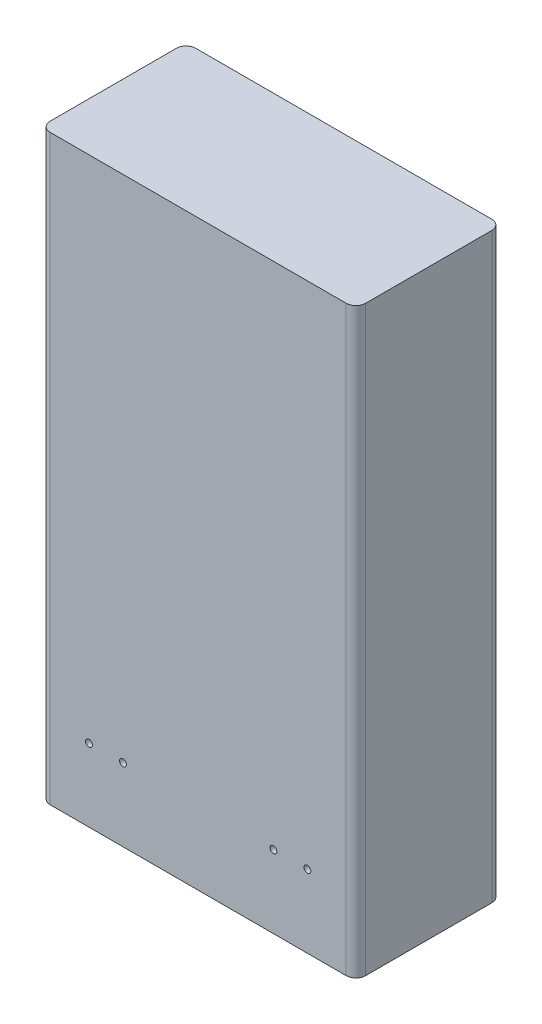
ISO-10303-21;
HEADER;
FILE_DESCRIPTION(('STEP AP214'),'2;1');
FILE_NAME('part.step','',(''),(''),'','','');
FILE_SCHEMA(('AUTOMOTIVE_DESIGN { 1 0 10303 214 1 1 1 1 }'));
ENDSEC;
DATA;
#1=APPLICATION_CONTEXT('core data for automotive mechanical design processes');
#2=APPLICATION_PROTOCOL_DEFINITION('international standard','automotive_design',2000,#1);
#3=PRODUCT_CONTEXT('',#1,'mechanical');
#4=PRODUCT('Part','Part','',(#3));
#5=PRODUCT_RELATED_PRODUCT_CATEGORY('part','',(#4));
#6=PRODUCT_DEFINITION_FORMATION('','',#4);
#7=PRODUCT_DEFINITION_CONTEXT('part definition',#1,'design');
#8=PRODUCT_DEFINITION('design','',#6,#7);
#9=PRODUCT_DEFINITION_SHAPE('','',#8);
#10=(LENGTH_UNIT() NAMED_UNIT(*) SI_UNIT(.MILLI.,.METRE.));
#11=(NAMED_UNIT(*) PLANE_ANGLE_UNIT() SI_UNIT($,.RADIAN.));
#12=(NAMED_UNIT(*) SI_UNIT($,.STERADIAN.) SOLID_ANGLE_UNIT());
#13=UNCERTAINTY_MEASURE_WITH_UNIT(LENGTH_MEASURE(1.E-05),#10,'distance_accuracy_value','');
#14=(GEOMETRIC_REPRESENTATION_CONTEXT(3) GLOBAL_UNCERTAINTY_ASSIGNED_CONTEXT((#13)) GLOBAL_UNIT_ASSIGNED_CONTEXT((#10,
#11,#12)) REPRESENTATION_CONTEXT('',''));
#15=CARTESIAN_POINT('',(0.,0.,0.));
#16=DIRECTION('',(0.,0.,1.));
#17=DIRECTION('',(1.,0.,0.));
#18=AXIS2_PLACEMENT_3D('',#15,#16,#17);
#19=CARTESIAN_POINT('',(41.275,-76.2,19.05));
#20=DIRECTION('',(-1.,0.,0.));
#21=DIRECTION('',(0.,0.,1.));
#22=AXIS2_PLACEMENT_3D('',#19,#20,#21);
#23=PLANE('',#22);
#24=DIRECTION('',(0.,0.,-1.));
#25=VECTOR('',#24,1.);
#26=CARTESIAN_POINT('',(41.275,-76.2,19.05));
#27=LINE('',#26,#25);
#28=CARTESIAN_POINT('',(41.275,-76.2,16.51));
#29=VERTEX_POINT('',#28);
#30=CARTESIAN_POINT('',(41.275,-76.2,-16.51));
#31=VERTEX_POINT('',#30);
#32=EDGE_CURVE('E162',#29,#31,#27,.T.);
#33=ORIENTED_EDGE('',*,*,#32,.T.);
#34=DIRECTION('',(0.,1.,0.));
#35=VECTOR('',#34,1.);
#36=CARTESIAN_POINT('',(41.275,76.2,-16.51));
#37=LINE('',#36,#35);
#38=CARTESIAN_POINT('',(41.275,76.2,-16.51));
#39=VERTEX_POINT('',#38);
#40=EDGE_CURVE('E118',#31,#39,#37,.T.);
#41=ORIENTED_EDGE('',*,*,#40,.T.);
#42=DIRECTION('',(0.,0.,-1.));
#43=VECTOR('',#42,1.);
#44=CARTESIAN_POINT('',(41.275,76.2,19.05));
#45=LINE('',#44,#43);
#46=CARTESIAN_POINT('',(41.275,76.2,16.51));
#47=VERTEX_POINT('',#46);
#48=EDGE_CURVE('E102',#47,#39,#45,.T.);
#49=ORIENTED_EDGE('',*,*,#48,.F.);
#50=DIRECTION('',(0.,1.,0.));
#51=VECTOR('',#50,1.);
#52=CARTESIAN_POINT('',(41.275,-76.2,16.51));
#53=LINE('',#52,#51);
#54=EDGE_CURVE('E115',#47,#29,#53,.F.);
#55=ORIENTED_EDGE('',*,*,#54,.T.);
#56=EDGE_LOOP('',(#33,#41,#49,#55));
#57=FACE_BOUND('',#56,.T.);
#58=ADVANCED_FACE('F33',(#57),#23,.F.);
#59=CARTESIAN_POINT('',(-41.275,76.2,19.05));
#60=DIRECTION('',(0.,-1.,0.));
#61=DIRECTION('',(0.,0.,-1.));
#62=AXIS2_PLACEMENT_3D('',#59,#60,#61);
#63=PLANE('',#62);
#64=ORIENTED_EDGE('',*,*,#48,.T.);
#65=CARTESIAN_POINT('',(38.735,76.2,-16.51));
#66=DIRECTION('',(0.,-1.,0.));
#67=DIRECTION('',(0.,0.,-1.));
#68=AXIS2_PLACEMENT_3D('',#65,#66,#67);
#69=CIRCLE('',#68,2.54);
#70=CARTESIAN_POINT('',(38.735,76.2,-19.05));
#71=VERTEX_POINT('',#70);
#72=EDGE_CURVE('E109',#39,#71,#69,.F.);
#73=ORIENTED_EDGE('',*,*,#72,.T.);
#74=DIRECTION('',(-1.,0.,0.));
#75=VECTOR('',#74,1.);
#76=CARTESIAN_POINT('',(-41.275,76.2,-19.05));
#77=LINE('',#76,#75);
#78=CARTESIAN_POINT('',(-38.735,76.2,-19.05));
#79=VERTEX_POINT('',#78);
#80=EDGE_CURVE('E169',#71,#79,#77,.T.);
#81=ORIENTED_EDGE('',*,*,#80,.T.);
#82=CARTESIAN_POINT('',(-38.735,76.2,-16.51));
#83=DIRECTION('',(0.,-1.,0.));
#84=DIRECTION('',(0.,0.,-1.));
#85=AXIS2_PLACEMENT_3D('',#82,#83,#84);
#86=CIRCLE('',#85,2.54);
#87=CARTESIAN_POINT('',(-41.275,76.2,-16.51));
#88=VERTEX_POINT('',#87);
#89=EDGE_CURVE('E110',#79,#88,#86,.F.);
#90=ORIENTED_EDGE('',*,*,#89,.T.);
#91=DIRECTION('',(0.,0.,-1.));
#92=VECTOR('',#91,1.);
#93=CARTESIAN_POINT('',(-41.275,76.2,19.05));
#94=LINE('',#93,#92);
#95=CARTESIAN_POINT('',(-41.275,76.2,16.51));
#96=VERTEX_POINT('',#95);
#97=EDGE_CURVE('E119',#96,#88,#94,.T.);
#98=ORIENTED_EDGE('',*,*,#97,.F.);
#99=CARTESIAN_POINT('',(-38.735,76.2,16.51));
#100=DIRECTION('',(0.,-1.,0.));
#101=DIRECTION('',(0.,0.,-1.));
#102=AXIS2_PLACEMENT_3D('',#99,#100,#101);
#103=CIRCLE('',#102,2.54);
#104=CARTESIAN_POINT('',(-38.735,76.2,19.05));
#105=VERTEX_POINT('',#104);
#106=EDGE_CURVE('E125',#96,#105,#103,.F.);
#107=ORIENTED_EDGE('',*,*,#106,.T.);
#108=DIRECTION('',(-1.,0.,0.));
#109=VECTOR('',#108,1.);
#110=CARTESIAN_POINT('',(-41.275,76.2,19.05));
#111=LINE('',#110,#109);
#112=CARTESIAN_POINT('',(38.735,76.2,19.05));
#113=VERTEX_POINT('',#112);
#114=EDGE_CURVE('E104',#113,#105,#111,.T.);
#115=ORIENTED_EDGE('',*,*,#114,.F.);
#116=CARTESIAN_POINT('',(38.735,76.2,16.51));
#117=DIRECTION('',(0.,-1.,0.));
#118=DIRECTION('',(0.,0.,-1.));
#119=AXIS2_PLACEMENT_3D('',#116,#117,#118);
#120=CIRCLE('',#119,2.54);
#121=EDGE_CURVE('E99',#113,#47,#120,.F.);
#122=ORIENTED_EDGE('',*,*,#121,.T.);
#123=EDGE_LOOP('',(#64,#73,#81,#90,#98,#107,#115,#122));
#124=FACE_BOUND('',#123,.T.);
#125=ADVANCED_FACE('F101',(#124),#63,.F.);
#126=CARTESIAN_POINT('',(-41.275,-76.2,19.05));
#127=DIRECTION('',(1.,0.,0.));
#128=DIRECTION('',(0.,0.,-1.));
#129=AXIS2_PLACEMENT_3D('',#126,#127,#128);
#130=PLANE('',#129);
#131=ORIENTED_EDGE('',*,*,#97,.T.);
#132=DIRECTION('',(0.,-1.,0.));
#133=VECTOR('',#132,1.);
#134=CARTESIAN_POINT('',(-41.275,-76.2,-16.51));
#135=LINE('',#134,#133);
#136=CARTESIAN_POINT('',(-41.275,-76.2,-16.51));
#137=VERTEX_POINT('',#136);
#138=EDGE_CURVE('E11',#88,#137,#135,.T.);
#139=ORIENTED_EDGE('',*,*,#138,.T.);
#140=DIRECTION('',(0.,0.,-1.));
#141=VECTOR('',#140,1.);
#142=CARTESIAN_POINT('',(-41.275,-76.2,19.05));
#143=LINE('',#142,#141);
#144=CARTESIAN_POINT('',(-41.275,-76.2,16.51));
#145=VERTEX_POINT('',#144);
#146=EDGE_CURVE('E150',#145,#137,#143,.T.);
#147=ORIENTED_EDGE('',*,*,#146,.F.);
#148=DIRECTION('',(0.,-1.,0.));
#149=VECTOR('',#148,1.);
#150=CARTESIAN_POINT('',(-41.275,-76.2,16.51));
#151=LINE('',#150,#149);
#152=EDGE_CURVE('E41',#145,#96,#151,.F.);
#153=ORIENTED_EDGE('',*,*,#152,.T.);
#154=EDGE_LOOP('',(#131,#139,#147,#153));
#155=FACE_BOUND('',#154,.T.);
#156=ADVANCED_FACE('F149',(#155),#130,.F.);
#157=CARTESIAN_POINT('',(-41.275,-76.2,19.05));
#158=DIRECTION('',(0.,1.,0.));
#159=DIRECTION('',(0.,0.,1.));
#160=AXIS2_PLACEMENT_3D('',#157,#158,#159);
#161=PLANE('',#160);
#162=DIRECTION('',(1.,0.,0.));
#163=VECTOR('',#162,1.);
#164=CARTESIAN_POINT('',(-41.275,-76.2,-19.05));
#165=LINE('',#164,#163);
#166=CARTESIAN_POINT('',(-38.735,-76.2,-19.05));
#167=VERTEX_POINT('',#166);
#168=CARTESIAN_POINT('',(38.735,-76.2,-19.05));
#169=VERTEX_POINT('',#168);
#170=EDGE_CURVE('E165',#167,#169,#165,.T.);
#171=ORIENTED_EDGE('',*,*,#170,.T.);
#172=CARTESIAN_POINT('',(38.735,-76.2,-16.51));
#173=DIRECTION('',(0.,1.,0.));
#174=DIRECTION('',(0.,0.,1.));
#175=AXIS2_PLACEMENT_3D('',#172,#173,#174);
#176=CIRCLE('',#175,2.54);
#177=EDGE_CURVE('E139',#169,#31,#176,.F.);
#178=ORIENTED_EDGE('',*,*,#177,.T.);
#179=ORIENTED_EDGE('',*,*,#32,.F.);
#180=CARTESIAN_POINT('',(38.735,-76.2,16.51));
#181=DIRECTION('',(0.,1.,0.));
#182=DIRECTION('',(0.,0.,1.));
#183=AXIS2_PLACEMENT_3D('',#180,#181,#182);
#184=CIRCLE('',#183,2.54);
#185=CARTESIAN_POINT('',(38.735,-76.2,19.05));
#186=VERTEX_POINT('',#185);
#187=EDGE_CURVE('E123',#29,#186,#184,.F.);
#188=ORIENTED_EDGE('',*,*,#187,.T.);
#189=DIRECTION('',(1.,0.,0.));
#190=VECTOR('',#189,1.);
#191=CARTESIAN_POINT('',(-41.275,-76.2,19.05));
#192=LINE('',#191,#190);
#193=CARTESIAN_POINT('',(-38.735,-76.2,19.05));
#194=VERTEX_POINT('',#193);
#195=EDGE_CURVE('E159',#194,#186,#192,.T.);
#196=ORIENTED_EDGE('',*,*,#195,.F.);
#197=CARTESIAN_POINT('',(-38.735,-76.2,16.51));
#198=DIRECTION('',(0.,1.,0.));
#199=DIRECTION('',(0.,0.,1.));
#200=AXIS2_PLACEMENT_3D('',#197,#198,#199);
#201=CIRCLE('',#200,2.54);
#202=EDGE_CURVE('E55',#194,#145,#201,.F.);
#203=ORIENTED_EDGE('',*,*,#202,.T.);
#204=ORIENTED_EDGE('',*,*,#146,.T.);
#205=CARTESIAN_POINT('',(-38.735,-76.2,-16.51));
#206=DIRECTION('',(0.,1.,0.));
#207=DIRECTION('',(0.,0.,1.));
#208=AXIS2_PLACEMENT_3D('',#205,#206,#207);
#209=CIRCLE('',#208,2.54);
#210=EDGE_CURVE('E48',#137,#167,#209,.F.);
#211=ORIENTED_EDGE('',*,*,#210,.T.);
#212=EDGE_LOOP('',(#171,#178,#179,#188,#196,#203,#204,#211));
#213=FACE_BOUND('',#212,.T.);
#214=ADVANCED_FACE('F161',(#213),#161,.F.);
#215=CARTESIAN_POINT('',(0.,0.,19.05));
#216=DIRECTION('',(0.,0.,-1.));
#217=DIRECTION('',(-1.,0.,0.));
#218=AXIS2_PLACEMENT_3D('',#215,#216,#217);
#219=PLANE('',#218);
#220=CARTESIAN_POINT('',(-19.685,-57.15,19.05));
#221=DIRECTION('',(0.,0.,1.));
#222=DIRECTION('',(1.,0.,0.));
#223=AXIS2_PLACEMENT_3D('',#220,#221,#222);
#224=CIRCLE('',#223,0.888999999999999);
#225=CARTESIAN_POINT('',(-18.796,-57.15,19.05));
#226=VERTEX_POINT('',#225);
#227=EDGE_CURVE('E329',#226,#226,#224,.T.);
#228=ORIENTED_EDGE('',*,*,#227,.F.);
#229=EDGE_LOOP('',(#228));
#230=FACE_BOUND('',#229,.T.);
#231=CARTESIAN_POINT('',(28.575,-57.15,19.05));
#232=DIRECTION('',(0.,0.,1.));
#233=DIRECTION('',(1.,0.,0.));
#234=AXIS2_PLACEMENT_3D('',#231,#232,#233);
#235=CIRCLE('',#234,0.888999999999999);
#236=CARTESIAN_POINT('',(29.464,-57.15,19.05));
#237=VERTEX_POINT('',#236);
#238=EDGE_CURVE('E325',#237,#237,#235,.T.);
#239=ORIENTED_EDGE('',*,*,#238,.F.);
#240=EDGE_LOOP('',(#239));
#241=FACE_BOUND('',#240,.T.);
#242=CARTESIAN_POINT('',(19.685,-57.15,19.05));
#243=DIRECTION('',(0.,0.,1.));
#244=DIRECTION('',(1.,0.,0.));
#245=AXIS2_PLACEMENT_3D('',#242,#243,#244);
#246=CIRCLE('',#245,0.888999999999999);
#247=CARTESIAN_POINT('',(20.574,-57.15,19.05));
#248=VERTEX_POINT('',#247);
#249=EDGE_CURVE('E321',#248,#248,#246,.T.);
#250=ORIENTED_EDGE('',*,*,#249,.F.);
#251=EDGE_LOOP('',(#250));
#252=FACE_BOUND('',#251,.T.);
#253=CARTESIAN_POINT('',(-28.575,-57.15,19.05));
#254=DIRECTION('',(0.,0.,1.));
#255=DIRECTION('',(1.,0.,0.));
#256=AXIS2_PLACEMENT_3D('',#253,#254,#255);
#257=CIRCLE('',#256,0.888999999999999);
#258=CARTESIAN_POINT('',(-27.686,-57.15,19.05));
#259=VERTEX_POINT('',#258);
#260=EDGE_CURVE('E317',#259,#259,#257,.T.);
#261=ORIENTED_EDGE('',*,*,#260,.F.);
#262=EDGE_LOOP('',(#261));
#263=FACE_BOUND('',#262,.T.);
#264=ORIENTED_EDGE('',*,*,#195,.T.);
#265=DIRECTION('',(0.,1.,0.));
#266=VECTOR('',#265,1.);
#267=CARTESIAN_POINT('',(38.735,0.,19.05));
#268=LINE('',#267,#266);
#269=EDGE_CURVE('E144',#186,#113,#268,.T.);
#270=ORIENTED_EDGE('',*,*,#269,.T.);
#271=ORIENTED_EDGE('',*,*,#114,.T.);
#272=DIRECTION('',(0.,-1.,0.));
#273=VECTOR('',#272,1.);
#274=CARTESIAN_POINT('',(-38.735,0.,19.05));
#275=LINE('',#274,#273);
#276=EDGE_CURVE('E141',#105,#194,#275,.T.);
#277=ORIENTED_EDGE('',*,*,#276,.T.);
#278=EDGE_LOOP('',(#264,#270,#271,#277));
#279=FACE_BOUND('',#278,.T.);
#280=ADVANCED_FACE('F158',(#230,#241,#252,#263,#279),#219,.F.);
#281=CARTESIAN_POINT('',(0.,0.,-19.05));
#282=DIRECTION('',(0.,0.,-1.));
#283=DIRECTION('',(-1.,0.,0.));
#284=AXIS2_PLACEMENT_3D('',#281,#282,#283);
#285=PLANE('',#284);
#286=CARTESIAN_POINT('',(-19.685,-57.15,-19.05));
#287=DIRECTION('',(0.,0.,1.));
#288=DIRECTION('',(1.,0.,0.));
#289=AXIS2_PLACEMENT_3D('',#286,#287,#288);
#290=CIRCLE('',#289,0.888999999999999);
#291=CARTESIAN_POINT('',(-18.796,-57.15,-19.05));
#292=VERTEX_POINT('',#291);
#293=EDGE_CURVE('E306',#292,#292,#290,.T.);
#294=ORIENTED_EDGE('',*,*,#293,.T.);
#295=EDGE_LOOP('',(#294));
#296=FACE_BOUND('',#295,.T.);
#297=CARTESIAN_POINT('',(28.575,-57.15,-19.05));
#298=DIRECTION('',(0.,0.,1.));
#299=DIRECTION('',(1.,0.,0.));
#300=AXIS2_PLACEMENT_3D('',#297,#298,#299);
#301=CIRCLE('',#300,0.888999999999999);
#302=CARTESIAN_POINT('',(29.464,-57.15,-19.05));
#303=VERTEX_POINT('',#302);
#304=EDGE_CURVE('E310',#303,#303,#301,.T.);
#305=ORIENTED_EDGE('',*,*,#304,.T.);
#306=EDGE_LOOP('',(#305));
#307=FACE_BOUND('',#306,.T.);
#308=CARTESIAN_POINT('',(19.685,-57.15,-19.05));
#309=DIRECTION('',(0.,0.,1.));
#310=DIRECTION('',(1.,0.,0.));
#311=AXIS2_PLACEMENT_3D('',#308,#309,#310);
#312=CIRCLE('',#311,0.888999999999999);
#313=CARTESIAN_POINT('',(20.574,-57.15,-19.05));
#314=VERTEX_POINT('',#313);
#315=EDGE_CURVE('E314',#314,#314,#312,.T.);
#316=ORIENTED_EDGE('',*,*,#315,.T.);
#317=EDGE_LOOP('',(#316));
#318=FACE_BOUND('',#317,.T.);
#319=CARTESIAN_POINT('',(-28.575,-57.15,-19.05));
#320=DIRECTION('',(0.,0.,1.));
#321=DIRECTION('',(1.,0.,0.));
#322=AXIS2_PLACEMENT_3D('',#319,#320,#321);
#323=CIRCLE('',#322,0.888999999999999);
#324=CARTESIAN_POINT('',(-27.686,-57.15,-19.05));
#325=VERTEX_POINT('',#324);
#326=EDGE_CURVE('E171',#325,#325,#323,.T.);
#327=ORIENTED_EDGE('',*,*,#326,.T.);
#328=EDGE_LOOP('',(#327));
#329=FACE_BOUND('',#328,.T.);
#330=ORIENTED_EDGE('',*,*,#80,.F.);
#331=DIRECTION('',(0.,1.,0.));
#332=VECTOR('',#331,1.);
#333=CARTESIAN_POINT('',(38.735,-76.2,-19.05));
#334=LINE('',#333,#332);
#335=EDGE_CURVE('E134',#71,#169,#334,.F.);
#336=ORIENTED_EDGE('',*,*,#335,.T.);
#337=ORIENTED_EDGE('',*,*,#170,.F.);
#338=DIRECTION('',(0.,-1.,0.));
#339=VECTOR('',#338,1.);
#340=CARTESIAN_POINT('',(-38.735,76.2,-19.05));
#341=LINE('',#340,#339);
#342=EDGE_CURVE('E132',#167,#79,#341,.F.);
#343=ORIENTED_EDGE('',*,*,#342,.T.);
#344=EDGE_LOOP('',(#330,#336,#337,#343));
#345=FACE_BOUND('',#344,.T.);
#346=ADVANCED_FACE('F177',(#296,#307,#318,#329,#345),#285,.T.);
#347=CARTESIAN_POINT('',(-28.575,-57.15,-19.05));
#348=DIRECTION('',(0.,0.,1.));
#349=DIRECTION('',(1.,0.,0.));
#350=AXIS2_PLACEMENT_3D('',#347,#348,#349);
#351=CYLINDRICAL_SURFACE('',#350,0.888999999999999);
#352=CARTESIAN_POINT('',(-27.686,-57.15,-19.05));
#353=CARTESIAN_POINT('',(-27.686,-57.15,-18.653125));
#354=CARTESIAN_POINT('',(-27.686,-57.15,-18.25625));
#355=CARTESIAN_POINT('',(-27.686,-57.15,-17.4625));
#356=CARTESIAN_POINT('',(-27.686,-57.15,-17.065625));
#357=CARTESIAN_POINT('',(-27.686,-57.15,-16.271875));
#358=CARTESIAN_POINT('',(-27.686,-57.15,-15.875));
#359=CARTESIAN_POINT('',(-27.686,-57.15,-15.08125));
#360=CARTESIAN_POINT('',(-27.686,-57.15,-14.684375));
#361=CARTESIAN_POINT('',(-27.686,-57.15,-13.890625));
#362=CARTESIAN_POINT('',(-27.686,-57.15,-13.49375));
#363=CARTESIAN_POINT('',(-27.686,-57.15,-12.7));
#364=CARTESIAN_POINT('',(-27.686,-57.15,-12.303125));
#365=CARTESIAN_POINT('',(-27.686,-57.15,-11.509375));
#366=CARTESIAN_POINT('',(-27.686,-57.15,-11.1125));
#367=CARTESIAN_POINT('',(-27.686,-57.15,-10.31875));
#368=CARTESIAN_POINT('',(-27.686,-57.15,-9.921875));
#369=CARTESIAN_POINT('',(-27.686,-57.15,-9.128125));
#370=CARTESIAN_POINT('',(-27.686,-57.15,-8.73125));
#371=CARTESIAN_POINT('',(-27.686,-57.15,-7.9375));
#372=CARTESIAN_POINT('',(-27.686,-57.15,-7.540625));
#373=CARTESIAN_POINT('',(-27.686,-57.15,-6.746875));
#374=CARTESIAN_POINT('',(-27.686,-57.15,-6.35));
#375=CARTESIAN_POINT('',(-27.686,-57.15,-5.55625));
#376=CARTESIAN_POINT('',(-27.686,-57.15,-5.159375));
#377=CARTESIAN_POINT('',(-27.686,-57.15,-4.365625));
#378=CARTESIAN_POINT('',(-27.686,-57.15,-3.96875));
#379=CARTESIAN_POINT('',(-27.686,-57.15,-3.175));
#380=CARTESIAN_POINT('',(-27.686,-57.15,-2.778125));
#381=CARTESIAN_POINT('',(-27.686,-57.15,-1.984375));
#382=CARTESIAN_POINT('',(-27.686,-57.15,-1.5875));
#383=CARTESIAN_POINT('',(-27.686,-57.15,-0.79375));
#384=CARTESIAN_POINT('',(-27.686,-57.15,-0.396875));
#385=CARTESIAN_POINT('',(-27.686,-57.15,0.396875));
#386=CARTESIAN_POINT('',(-27.686,-57.15,0.79375));
#387=CARTESIAN_POINT('',(-27.686,-57.15,1.5875));
#388=CARTESIAN_POINT('',(-27.686,-57.15,1.984375));
#389=CARTESIAN_POINT('',(-27.686,-57.15,2.778125));
#390=CARTESIAN_POINT('',(-27.686,-57.15,3.175));
#391=CARTESIAN_POINT('',(-27.686,-57.15,3.96875));
#392=CARTESIAN_POINT('',(-27.686,-57.15,4.365625));
#393=CARTESIAN_POINT('',(-27.686,-57.15,5.159375));
#394=CARTESIAN_POINT('',(-27.686,-57.15,5.55625));
#395=CARTESIAN_POINT('',(-27.686,-57.15,6.35));
#396=CARTESIAN_POINT('',(-27.686,-57.15,6.746875));
#397=CARTESIAN_POINT('',(-27.686,-57.15,7.540625));
#398=CARTESIAN_POINT('',(-27.686,-57.15,7.9375));
#399=CARTESIAN_POINT('',(-27.686,-57.15,8.73125));
#400=CARTESIAN_POINT('',(-27.686,-57.15,9.128125));
#401=CARTESIAN_POINT('',(-27.686,-57.15,9.921875));
#402=CARTESIAN_POINT('',(-27.686,-57.15,10.31875));
#403=CARTESIAN_POINT('',(-27.686,-57.15,11.1125));
#404=CARTESIAN_POINT('',(-27.686,-57.15,11.509375));
#405=CARTESIAN_POINT('',(-27.686,-57.15,12.303125));
#406=CARTESIAN_POINT('',(-27.686,-57.15,12.7));
#407=CARTESIAN_POINT('',(-27.686,-57.15,13.49375));
#408=CARTESIAN_POINT('',(-27.686,-57.15,13.890625));
#409=CARTESIAN_POINT('',(-27.686,-57.15,14.684375));
#410=CARTESIAN_POINT('',(-27.686,-57.15,15.08125));
#411=CARTESIAN_POINT('',(-27.686,-57.15,15.875));
#412=CARTESIAN_POINT('',(-27.686,-57.15,16.271875));
#413=CARTESIAN_POINT('',(-27.686,-57.15,17.065625));
#414=CARTESIAN_POINT('',(-27.686,-57.15,17.4625));
#415=CARTESIAN_POINT('',(-27.686,-57.15,18.25625));
#416=CARTESIAN_POINT('',(-27.686,-57.15,18.653125));
#417=CARTESIAN_POINT('',(-27.686,-57.15,19.05));
#418=B_SPLINE_CURVE_WITH_KNOTS('',3,(#352,#353,#354,#355,#356,#357,#358,#359,#360,#361,#362,
#363,#364,#365,#366,#367,#368,#369,#370,#371,#372,#373,#374,#375,#376,#377,#378,#379,#380,#381,
#382,#383,#384,#385,#386,#387,#388,#389,#390,#391,#392,#393,#394,#395,#396,#397,#398,#399,#400,
#401,#402,#403,#404,#405,#406,#407,#408,#409,#410,#411,#412,#413,#414,#415,#416,#417),
.UNSPECIFIED.,.F.,.F.,(4,2,2,2,2,2,2,2,2,2,2,2,2,2,2,2,2,2,2,2,2,2,2,2,2,2,2,2,2,2,2,2,4),(0.,
1.190625,2.38125,3.571875,4.7625,5.953125,7.14375,8.334375,9.525,10.715625,11.90625,13.096875,
14.2875,15.478125,16.66875,17.859375,19.05,20.240625,21.43125,22.621875,23.8125,25.003125,
26.19375,27.384375,28.575,29.765625,30.95625,32.146875,33.3375,34.528125,35.71875,36.909375,
38.1),.UNSPECIFIED.);
#419=EDGE_CURVE('BSEAM215',#325,#259,#418,.T.);
#420=ORIENTED_EDGE('',*,*,#326,.F.);
#421=ORIENTED_EDGE('',*,*,#260,.T.);
#422=ORIENTED_EDGE('',*,*,#419,.T.);
#423=ORIENTED_EDGE('',*,*,#419,.F.);
#424=EDGE_LOOP('',(#420,#422,#421,#423));
#425=FACE_BOUND('',#424,.T.);
#426=ADVANCED_FACE('F215',(#425),#351,.F.);
#427=CARTESIAN_POINT('',(19.685,-57.15,-19.05));
#428=DIRECTION('',(0.,0.,1.));
#429=DIRECTION('',(1.,0.,0.));
#430=AXIS2_PLACEMENT_3D('',#427,#428,#429);
#431=CYLINDRICAL_SURFACE('',#430,0.888999999999999);
#432=CARTESIAN_POINT('',(20.574,-57.15,-19.05));
#433=CARTESIAN_POINT('',(20.574,-57.15,-18.653125));
#434=CARTESIAN_POINT('',(20.574,-57.15,-18.25625));
#435=CARTESIAN_POINT('',(20.574,-57.15,-17.4625));
#436=CARTESIAN_POINT('',(20.574,-57.15,-17.065625));
#437=CARTESIAN_POINT('',(20.574,-57.15,-16.271875));
#438=CARTESIAN_POINT('',(20.574,-57.15,-15.875));
#439=CARTESIAN_POINT('',(20.574,-57.15,-15.08125));
#440=CARTESIAN_POINT('',(20.574,-57.15,-14.684375));
#441=CARTESIAN_POINT('',(20.574,-57.15,-13.890625));
#442=CARTESIAN_POINT('',(20.574,-57.15,-13.49375));
#443=CARTESIAN_POINT('',(20.574,-57.15,-12.7));
#444=CARTESIAN_POINT('',(20.574,-57.15,-12.303125));
#445=CARTESIAN_POINT('',(20.574,-57.15,-11.509375));
#446=CARTESIAN_POINT('',(20.574,-57.15,-11.1125));
#447=CARTESIAN_POINT('',(20.574,-57.15,-10.31875));
#448=CARTESIAN_POINT('',(20.574,-57.15,-9.921875));
#449=CARTESIAN_POINT('',(20.574,-57.15,-9.128125));
#450=CARTESIAN_POINT('',(20.574,-57.15,-8.73125));
#451=CARTESIAN_POINT('',(20.574,-57.15,-7.9375));
#452=CARTESIAN_POINT('',(20.574,-57.15,-7.540625));
#453=CARTESIAN_POINT('',(20.574,-57.15,-6.746875));
#454=CARTESIAN_POINT('',(20.574,-57.15,-6.35));
#455=CARTESIAN_POINT('',(20.574,-57.15,-5.55625));
#456=CARTESIAN_POINT('',(20.574,-57.15,-5.159375));
#457=CARTESIAN_POINT('',(20.574,-57.15,-4.365625));
#458=CARTESIAN_POINT('',(20.574,-57.15,-3.96875));
#459=CARTESIAN_POINT('',(20.574,-57.15,-3.175));
#460=CARTESIAN_POINT('',(20.574,-57.15,-2.778125));
#461=CARTESIAN_POINT('',(20.574,-57.15,-1.984375));
#462=CARTESIAN_POINT('',(20.574,-57.15,-1.5875));
#463=CARTESIAN_POINT('',(20.574,-57.15,-0.79375));
#464=CARTESIAN_POINT('',(20.574,-57.15,-0.396875));
#465=CARTESIAN_POINT('',(20.574,-57.15,0.396875));
#466=CARTESIAN_POINT('',(20.574,-57.15,0.79375));
#467=CARTESIAN_POINT('',(20.574,-57.15,1.5875));
#468=CARTESIAN_POINT('',(20.574,-57.15,1.984375));
#469=CARTESIAN_POINT('',(20.574,-57.15,2.778125));
#470=CARTESIAN_POINT('',(20.574,-57.15,3.175));
#471=CARTESIAN_POINT('',(20.574,-57.15,3.96875));
#472=CARTESIAN_POINT('',(20.574,-57.15,4.365625));
#473=CARTESIAN_POINT('',(20.574,-57.15,5.159375));
#474=CARTESIAN_POINT('',(20.574,-57.15,5.55625));
#475=CARTESIAN_POINT('',(20.574,-57.15,6.35));
#476=CARTESIAN_POINT('',(20.574,-57.15,6.746875));
#477=CARTESIAN_POINT('',(20.574,-57.15,7.540625));
#478=CARTESIAN_POINT('',(20.574,-57.15,7.9375));
#479=CARTESIAN_POINT('',(20.574,-57.15,8.73125));
#480=CARTESIAN_POINT('',(20.574,-57.15,9.128125));
#481=CARTESIAN_POINT('',(20.574,-57.15,9.921875));
#482=CARTESIAN_POINT('',(20.574,-57.15,10.31875));
#483=CARTESIAN_POINT('',(20.574,-57.15,11.1125));
#484=CARTESIAN_POINT('',(20.574,-57.15,11.509375));
#485=CARTESIAN_POINT('',(20.574,-57.15,12.303125));
#486=CARTESIAN_POINT('',(20.574,-57.15,12.7));
#487=CARTESIAN_POINT('',(20.574,-57.15,13.49375));
#488=CARTESIAN_POINT('',(20.574,-57.15,13.890625));
#489=CARTESIAN_POINT('',(20.574,-57.15,14.684375));
#490=CARTESIAN_POINT('',(20.574,-57.15,15.08125));
#491=CARTESIAN_POINT('',(20.574,-57.15,15.875));
#492=CARTESIAN_POINT('',(20.574,-57.15,16.271875));
#493=CARTESIAN_POINT('',(20.574,-57.15,17.065625));
#494=CARTESIAN_POINT('',(20.574,-57.15,17.4625));
#495=CARTESIAN_POINT('',(20.574,-57.15,18.25625));
#496=CARTESIAN_POINT('',(20.574,-57.15,18.653125));
#497=CARTESIAN_POINT('',(20.574,-57.15,19.05));
#498=B_SPLINE_CURVE_WITH_KNOTS('',3,(#432,#433,#434,#435,#436,#437,#438,#439,#440,#441,#442,
#443,#444,#445,#446,#447,#448,#449,#450,#451,#452,#453,#454,#455,#456,#457,#458,#459,#460,#461,
#462,#463,#464,#465,#466,#467,#468,#469,#470,#471,#472,#473,#474,#475,#476,#477,#478,#479,#480,
#481,#482,#483,#484,#485,#486,#487,#488,#489,#490,#491,#492,#493,#494,#495,#496,#497),
.UNSPECIFIED.,.F.,.F.,(4,2,2,2,2,2,2,2,2,2,2,2,2,2,2,2,2,2,2,2,2,2,2,2,2,2,2,2,2,2,2,2,4),(0.,
1.190625,2.38125,3.571875,4.7625,5.953125,7.14375,8.334375,9.525,10.715625,11.90625,13.096875,
14.2875,15.478125,16.66875,17.859375,19.05,20.240625,21.43125,22.621875,23.8125,25.003125,
26.19375,27.384375,28.575,29.765625,30.95625,32.146875,33.3375,34.528125,35.71875,36.909375,
38.1),.UNSPECIFIED.);
#499=EDGE_CURVE('BSEAM207',#314,#248,#498,.T.);
#500=ORIENTED_EDGE('',*,*,#315,.F.);
#501=ORIENTED_EDGE('',*,*,#249,.T.);
#502=ORIENTED_EDGE('',*,*,#499,.T.);
#503=ORIENTED_EDGE('',*,*,#499,.F.);
#504=EDGE_LOOP('',(#500,#502,#501,#503));
#505=FACE_BOUND('',#504,.T.);
#506=ADVANCED_FACE('F207',(#505),#431,.F.);
#507=CARTESIAN_POINT('',(28.575,-57.15,-19.05));
#508=DIRECTION('',(0.,0.,1.));
#509=DIRECTION('',(1.,0.,0.));
#510=AXIS2_PLACEMENT_3D('',#507,#508,#509);
#511=CYLINDRICAL_SURFACE('',#510,0.888999999999999);
#512=CARTESIAN_POINT('',(29.464,-57.15,-19.05));
#513=CARTESIAN_POINT('',(29.464,-57.15,-18.653125));
#514=CARTESIAN_POINT('',(29.464,-57.15,-18.25625));
#515=CARTESIAN_POINT('',(29.464,-57.15,-17.4625));
#516=CARTESIAN_POINT('',(29.464,-57.15,-17.065625));
#517=CARTESIAN_POINT('',(29.464,-57.15,-16.271875));
#518=CARTESIAN_POINT('',(29.464,-57.15,-15.875));
#519=CARTESIAN_POINT('',(29.464,-57.15,-15.08125));
#520=CARTESIAN_POINT('',(29.464,-57.15,-14.684375));
#521=CARTESIAN_POINT('',(29.464,-57.15,-13.890625));
#522=CARTESIAN_POINT('',(29.464,-57.15,-13.49375));
#523=CARTESIAN_POINT('',(29.464,-57.15,-12.7));
#524=CARTESIAN_POINT('',(29.464,-57.15,-12.303125));
#525=CARTESIAN_POINT('',(29.464,-57.15,-11.509375));
#526=CARTESIAN_POINT('',(29.464,-57.15,-11.1125));
#527=CARTESIAN_POINT('',(29.464,-57.15,-10.31875));
#528=CARTESIAN_POINT('',(29.464,-57.15,-9.921875));
#529=CARTESIAN_POINT('',(29.464,-57.15,-9.128125));
#530=CARTESIAN_POINT('',(29.464,-57.15,-8.73125));
#531=CARTESIAN_POINT('',(29.464,-57.15,-7.9375));
#532=CARTESIAN_POINT('',(29.464,-57.15,-7.540625));
#533=CARTESIAN_POINT('',(29.464,-57.15,-6.746875));
#534=CARTESIAN_POINT('',(29.464,-57.15,-6.35));
#535=CARTESIAN_POINT('',(29.464,-57.15,-5.55625));
#536=CARTESIAN_POINT('',(29.464,-57.15,-5.159375));
#537=CARTESIAN_POINT('',(29.464,-57.15,-4.365625));
#538=CARTESIAN_POINT('',(29.464,-57.15,-3.96875));
#539=CARTESIAN_POINT('',(29.464,-57.15,-3.175));
#540=CARTESIAN_POINT('',(29.464,-57.15,-2.778125));
#541=CARTESIAN_POINT('',(29.464,-57.15,-1.984375));
#542=CARTESIAN_POINT('',(29.464,-57.15,-1.5875));
#543=CARTESIAN_POINT('',(29.464,-57.15,-0.79375));
#544=CARTESIAN_POINT('',(29.464,-57.15,-0.396875));
#545=CARTESIAN_POINT('',(29.464,-57.15,0.396875));
#546=CARTESIAN_POINT('',(29.464,-57.15,0.79375));
#547=CARTESIAN_POINT('',(29.464,-57.15,1.5875));
#548=CARTESIAN_POINT('',(29.464,-57.15,1.984375));
#549=CARTESIAN_POINT('',(29.464,-57.15,2.778125));
#550=CARTESIAN_POINT('',(29.464,-57.15,3.175));
#551=CARTESIAN_POINT('',(29.464,-57.15,3.96875));
#552=CARTESIAN_POINT('',(29.464,-57.15,4.365625));
#553=CARTESIAN_POINT('',(29.464,-57.15,5.159375));
#554=CARTESIAN_POINT('',(29.464,-57.15,5.55625));
#555=CARTESIAN_POINT('',(29.464,-57.15,6.35));
#556=CARTESIAN_POINT('',(29.464,-57.15,6.746875));
#557=CARTESIAN_POINT('',(29.464,-57.15,7.540625));
#558=CARTESIAN_POINT('',(29.464,-57.15,7.9375));
#559=CARTESIAN_POINT('',(29.464,-57.15,8.73125));
#560=CARTESIAN_POINT('',(29.464,-57.15,9.128125));
#561=CARTESIAN_POINT('',(29.464,-57.15,9.921875));
#562=CARTESIAN_POINT('',(29.464,-57.15,10.31875));
#563=CARTESIAN_POINT('',(29.464,-57.15,11.1125));
#564=CARTESIAN_POINT('',(29.464,-57.15,11.509375));
#565=CARTESIAN_POINT('',(29.464,-57.15,12.303125));
#566=CARTESIAN_POINT('',(29.464,-57.15,12.7));
#567=CARTESIAN_POINT('',(29.464,-57.15,13.49375));
#568=CARTESIAN_POINT('',(29.464,-57.15,13.890625));
#569=CARTESIAN_POINT('',(29.464,-57.15,14.684375));
#570=CARTESIAN_POINT('',(29.464,-57.15,15.08125));
#571=CARTESIAN_POINT('',(29.464,-57.15,15.875));
#572=CARTESIAN_POINT('',(29.464,-57.15,16.271875));
#573=CARTESIAN_POINT('',(29.464,-57.15,17.065625));
#574=CARTESIAN_POINT('',(29.464,-57.15,17.4625));
#575=CARTESIAN_POINT('',(29.464,-57.15,18.25625));
#576=CARTESIAN_POINT('',(29.464,-57.15,18.653125));
#577=CARTESIAN_POINT('',(29.464,-57.15,19.05));
#578=B_SPLINE_CURVE_WITH_KNOTS('',3,(#512,#513,#514,#515,#516,#517,#518,#519,#520,#521,#522,
#523,#524,#525,#526,#527,#528,#529,#530,#531,#532,#533,#534,#535,#536,#537,#538,#539,#540,#541,
#542,#543,#544,#545,#546,#547,#548,#549,#550,#551,#552,#553,#554,#555,#556,#557,#558,#559,#560,
#561,#562,#563,#564,#565,#566,#567,#568,#569,#570,#571,#572,#573,#574,#575,#576,#577),
.UNSPECIFIED.,.F.,.F.,(4,2,2,2,2,2,2,2,2,2,2,2,2,2,2,2,2,2,2,2,2,2,2,2,2,2,2,2,2,2,2,2,4),(0.,
1.190625,2.38125,3.571875,4.7625,5.953125,7.14375,8.334375,9.525,10.715625,11.90625,13.096875,
14.2875,15.478125,16.66875,17.859375,19.05,20.240625,21.43125,22.621875,23.8125,25.003125,
26.19375,27.384375,28.575,29.765625,30.95625,32.146875,33.3375,34.528125,35.71875,36.909375,
38.1),.UNSPECIFIED.);
#579=EDGE_CURVE('BSEAM201',#303,#237,#578,.T.);
#580=ORIENTED_EDGE('',*,*,#304,.F.);
#581=ORIENTED_EDGE('',*,*,#238,.T.);
#582=ORIENTED_EDGE('',*,*,#579,.T.);
#583=ORIENTED_EDGE('',*,*,#579,.F.);
#584=EDGE_LOOP('',(#580,#582,#581,#583));
#585=FACE_BOUND('',#584,.T.);
#586=ADVANCED_FACE('F201',(#585),#511,.F.);
#587=CARTESIAN_POINT('',(-19.685,-57.15,-19.05));
#588=DIRECTION('',(0.,0.,1.));
#589=DIRECTION('',(1.,0.,0.));
#590=AXIS2_PLACEMENT_3D('',#587,#588,#589);
#591=CYLINDRICAL_SURFACE('',#590,0.888999999999999);
#592=CARTESIAN_POINT('',(-18.796,-57.15,-19.05));
#593=CARTESIAN_POINT('',(-18.796,-57.15,-18.653125));
#594=CARTESIAN_POINT('',(-18.796,-57.15,-18.25625));
#595=CARTESIAN_POINT('',(-18.796,-57.15,-17.4625));
#596=CARTESIAN_POINT('',(-18.796,-57.15,-17.065625));
#597=CARTESIAN_POINT('',(-18.796,-57.15,-16.271875));
#598=CARTESIAN_POINT('',(-18.796,-57.15,-15.875));
#599=CARTESIAN_POINT('',(-18.796,-57.15,-15.08125));
#600=CARTESIAN_POINT('',(-18.796,-57.15,-14.684375));
#601=CARTESIAN_POINT('',(-18.796,-57.15,-13.890625));
#602=CARTESIAN_POINT('',(-18.796,-57.15,-13.49375));
#603=CARTESIAN_POINT('',(-18.796,-57.15,-12.7));
#604=CARTESIAN_POINT('',(-18.796,-57.15,-12.303125));
#605=CARTESIAN_POINT('',(-18.796,-57.15,-11.509375));
#606=CARTESIAN_POINT('',(-18.796,-57.15,-11.1125));
#607=CARTESIAN_POINT('',(-18.796,-57.15,-10.31875));
#608=CARTESIAN_POINT('',(-18.796,-57.15,-9.921875));
#609=CARTESIAN_POINT('',(-18.796,-57.15,-9.128125));
#610=CARTESIAN_POINT('',(-18.796,-57.15,-8.73125));
#611=CARTESIAN_POINT('',(-18.796,-57.15,-7.9375));
#612=CARTESIAN_POINT('',(-18.796,-57.15,-7.540625));
#613=CARTESIAN_POINT('',(-18.796,-57.15,-6.746875));
#614=CARTESIAN_POINT('',(-18.796,-57.15,-6.35));
#615=CARTESIAN_POINT('',(-18.796,-57.15,-5.55625));
#616=CARTESIAN_POINT('',(-18.796,-57.15,-5.159375));
#617=CARTESIAN_POINT('',(-18.796,-57.15,-4.365625));
#618=CARTESIAN_POINT('',(-18.796,-57.15,-3.96875));
#619=CARTESIAN_POINT('',(-18.796,-57.15,-3.175));
#620=CARTESIAN_POINT('',(-18.796,-57.15,-2.778125));
#621=CARTESIAN_POINT('',(-18.796,-57.15,-1.984375));
#622=CARTESIAN_POINT('',(-18.796,-57.15,-1.5875));
#623=CARTESIAN_POINT('',(-18.796,-57.15,-0.79375));
#624=CARTESIAN_POINT('',(-18.796,-57.15,-0.396875));
#625=CARTESIAN_POINT('',(-18.796,-57.15,0.396875));
#626=CARTESIAN_POINT('',(-18.796,-57.15,0.79375));
#627=CARTESIAN_POINT('',(-18.796,-57.15,1.5875));
#628=CARTESIAN_POINT('',(-18.796,-57.15,1.984375));
#629=CARTESIAN_POINT('',(-18.796,-57.15,2.778125));
#630=CARTESIAN_POINT('',(-18.796,-57.15,3.175));
#631=CARTESIAN_POINT('',(-18.796,-57.15,3.96875));
#632=CARTESIAN_POINT('',(-18.796,-57.15,4.365625));
#633=CARTESIAN_POINT('',(-18.796,-57.15,5.159375));
#634=CARTESIAN_POINT('',(-18.796,-57.15,5.55625));
#635=CARTESIAN_POINT('',(-18.796,-57.15,6.35));
#636=CARTESIAN_POINT('',(-18.796,-57.15,6.746875));
#637=CARTESIAN_POINT('',(-18.796,-57.15,7.540625));
#638=CARTESIAN_POINT('',(-18.796,-57.15,7.9375));
#639=CARTESIAN_POINT('',(-18.796,-57.15,8.73125));
#640=CARTESIAN_POINT('',(-18.796,-57.15,9.128125));
#641=CARTESIAN_POINT('',(-18.796,-57.15,9.921875));
#642=CARTESIAN_POINT('',(-18.796,-57.15,10.31875));
#643=CARTESIAN_POINT('',(-18.796,-57.15,11.1125));
#644=CARTESIAN_POINT('',(-18.796,-57.15,11.509375));
#645=CARTESIAN_POINT('',(-18.796,-57.15,12.303125));
#646=CARTESIAN_POINT('',(-18.796,-57.15,12.7));
#647=CARTESIAN_POINT('',(-18.796,-57.15,13.49375));
#648=CARTESIAN_POINT('',(-18.796,-57.15,13.890625));
#649=CARTESIAN_POINT('',(-18.796,-57.15,14.684375));
#650=CARTESIAN_POINT('',(-18.796,-57.15,15.08125));
#651=CARTESIAN_POINT('',(-18.796,-57.15,15.875));
#652=CARTESIAN_POINT('',(-18.796,-57.15,16.271875));
#653=CARTESIAN_POINT('',(-18.796,-57.15,17.065625));
#654=CARTESIAN_POINT('',(-18.796,-57.15,17.4625));
#655=CARTESIAN_POINT('',(-18.796,-57.15,18.25625));
#656=CARTESIAN_POINT('',(-18.796,-57.15,18.653125));
#657=CARTESIAN_POINT('',(-18.796,-57.15,19.05));
#658=B_SPLINE_CURVE_WITH_KNOTS('',3,(#592,#593,#594,#595,#596,#597,#598,#599,#600,#601,#602,
#603,#604,#605,#606,#607,#608,#609,#610,#611,#612,#613,#614,#615,#616,#617,#618,#619,#620,#621,
#622,#623,#624,#625,#626,#627,#628,#629,#630,#631,#632,#633,#634,#635,#636,#637,#638,#639,#640,
#641,#642,#643,#644,#645,#646,#647,#648,#649,#650,#651,#652,#653,#654,#655,#656,#657),
.UNSPECIFIED.,.F.,.F.,(4,2,2,2,2,2,2,2,2,2,2,2,2,2,2,2,2,2,2,2,2,2,2,2,2,2,2,2,2,2,2,2,4),(0.,
1.190625,2.38125,3.571875,4.7625,5.953125,7.14375,8.334375,9.525,10.715625,11.90625,13.096875,
14.2875,15.478125,16.66875,17.859375,19.05,20.240625,21.43125,22.621875,23.8125,25.003125,
26.19375,27.384375,28.575,29.765625,30.95625,32.146875,33.3375,34.528125,35.71875,36.909375,
38.1),.UNSPECIFIED.);
#659=EDGE_CURVE('BSEAM196',#292,#226,#658,.T.);
#660=ORIENTED_EDGE('',*,*,#293,.F.);
#661=ORIENTED_EDGE('',*,*,#227,.T.);
#662=ORIENTED_EDGE('',*,*,#659,.T.);
#663=ORIENTED_EDGE('',*,*,#659,.F.);
#664=EDGE_LOOP('',(#660,#662,#661,#663));
#665=FACE_BOUND('',#664,.T.);
#666=ADVANCED_FACE('F196',(#665),#591,.F.);
#667=CARTESIAN_POINT('',(38.735,-76.2,-16.51));
#668=DIRECTION('',(0.,-1.,0.));
#669=DIRECTION('',(0.,0.,-1.));
#670=AXIS2_PLACEMENT_3D('',#667,#668,#669);
#671=CYLINDRICAL_SURFACE('',#670,2.54);
#672=ORIENTED_EDGE('',*,*,#177,.F.);
#673=ORIENTED_EDGE('',*,*,#335,.F.);
#674=ORIENTED_EDGE('',*,*,#72,.F.);
#675=ORIENTED_EDGE('',*,*,#40,.F.);
#676=EDGE_LOOP('',(#672,#673,#674,#675));
#677=FACE_BOUND('',#676,.T.);
#678=ADVANCED_FACE('F185',(#677),#671,.T.);
#679=CARTESIAN_POINT('',(38.735,0.,16.51));
#680=DIRECTION('',(0.,1.,0.));
#681=DIRECTION('',(0.,0.,1.));
#682=AXIS2_PLACEMENT_3D('',#679,#680,#681);
#683=CYLINDRICAL_SURFACE('',#682,2.54);
#684=ORIENTED_EDGE('',*,*,#187,.F.);
#685=ORIENTED_EDGE('',*,*,#54,.F.);
#686=ORIENTED_EDGE('',*,*,#121,.F.);
#687=ORIENTED_EDGE('',*,*,#269,.F.);
#688=EDGE_LOOP('',(#684,#685,#686,#687));
#689=FACE_BOUND('',#688,.T.);
#690=ADVANCED_FACE('F122',(#689),#683,.T.);
#691=CARTESIAN_POINT('',(-38.735,-76.2,-16.51));
#692=DIRECTION('',(0.,1.,0.));
#693=DIRECTION('',(0.,0.,1.));
#694=AXIS2_PLACEMENT_3D('',#691,#692,#693);
#695=CYLINDRICAL_SURFACE('',#694,2.54);
#696=ORIENTED_EDGE('',*,*,#89,.F.);
#697=ORIENTED_EDGE('',*,*,#342,.F.);
#698=ORIENTED_EDGE('',*,*,#210,.F.);
#699=ORIENTED_EDGE('',*,*,#138,.F.);
#700=EDGE_LOOP('',(#696,#697,#698,#699));
#701=FACE_BOUND('',#700,.T.);
#702=ADVANCED_FACE('F179',(#701),#695,.T.);
#703=CARTESIAN_POINT('',(-38.735,0.,16.51));
#704=DIRECTION('',(0.,-1.,0.));
#705=DIRECTION('',(0.,0.,-1.));
#706=AXIS2_PLACEMENT_3D('',#703,#704,#705);
#707=CYLINDRICAL_SURFACE('',#706,2.54);
#708=ORIENTED_EDGE('',*,*,#106,.F.);
#709=ORIENTED_EDGE('',*,*,#152,.F.);
#710=ORIENTED_EDGE('',*,*,#202,.F.);
#711=ORIENTED_EDGE('',*,*,#276,.F.);
#712=EDGE_LOOP('',(#708,#709,#710,#711));
#713=FACE_BOUND('',#712,.T.);
#714=ADVANCED_FACE('F35',(#713),#707,.T.);
#715=CLOSED_SHELL('',(#58,#125,#156,#214,#280,#346,#426,#506,#586,#666,#678,#690,#702,#714));
#716=MANIFOLD_SOLID_BREP('B2',#715);
#717=ADVANCED_BREP_SHAPE_REPRESENTATION('',(#18,#716),#14);
#718=SHAPE_DEFINITION_REPRESENTATION(#9,#717);
ENDSEC;
END-ISO-10303-21;
